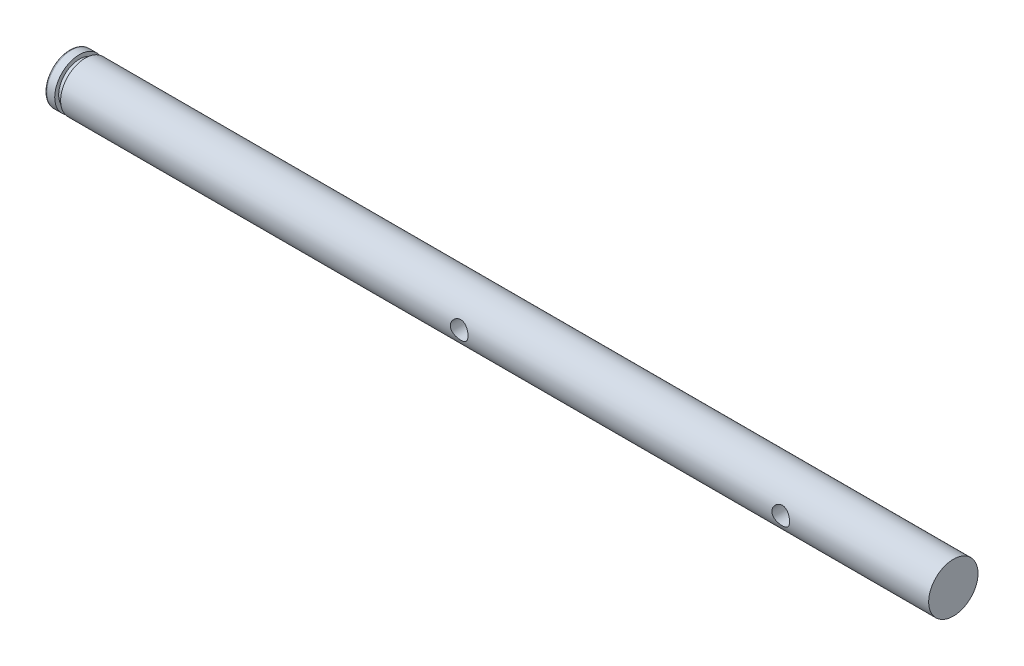
ISO-10303-21;
HEADER;
FILE_DESCRIPTION(('STEP AP214'),'2;1');
FILE_NAME('part.step','',(''),(''),'','','');
FILE_SCHEMA(('AUTOMOTIVE_DESIGN { 1 0 10303 214 1 1 1 1 }'));
ENDSEC;
DATA;
#1=APPLICATION_CONTEXT('core data for automotive mechanical design processes');
#2=APPLICATION_PROTOCOL_DEFINITION('international standard','automotive_design',2000,#1);
#3=PRODUCT_CONTEXT('',#1,'mechanical');
#4=PRODUCT('Part','Part','',(#3));
#5=PRODUCT_RELATED_PRODUCT_CATEGORY('part','',(#4));
#6=PRODUCT_DEFINITION_FORMATION('','',#4);
#7=PRODUCT_DEFINITION_CONTEXT('part definition',#1,'design');
#8=PRODUCT_DEFINITION('design','',#6,#7);
#9=PRODUCT_DEFINITION_SHAPE('','',#8);
#10=(LENGTH_UNIT() NAMED_UNIT(*) SI_UNIT(.MILLI.,.METRE.));
#11=(NAMED_UNIT(*) PLANE_ANGLE_UNIT() SI_UNIT($,.RADIAN.));
#12=(NAMED_UNIT(*) SI_UNIT($,.STERADIAN.) SOLID_ANGLE_UNIT());
#13=UNCERTAINTY_MEASURE_WITH_UNIT(LENGTH_MEASURE(1.E-05),#10,'distance_accuracy_value','');
#14=(GEOMETRIC_REPRESENTATION_CONTEXT(3) GLOBAL_UNCERTAINTY_ASSIGNED_CONTEXT((#13)) GLOBAL_UNIT_ASSIGNED_CONTEXT((#10,
#11,#12)) REPRESENTATION_CONTEXT('',''));
#15=CARTESIAN_POINT('',(0.,0.,0.));
#16=DIRECTION('',(0.,0.,1.));
#17=DIRECTION('',(1.,0.,0.));
#18=AXIS2_PLACEMENT_3D('',#15,#16,#17);
#19=CARTESIAN_POINT('',(-111.76,0.,0.));
#20=DIRECTION('',(1.,0.,0.));
#21=DIRECTION('',(0.,0.,-1.));
#22=AXIS2_PLACEMENT_3D('',#19,#20,#21);
#23=CYLINDRICAL_SURFACE('',#22,3.175);
#24=CARTESIAN_POINT('',(-59.309,0.,-3.175));
#25=CARTESIAN_POINT('',(-59.308998572082,-0.0620737268315115,-3.17500103437967));
#26=CARTESIAN_POINT('',(-59.3140726971616,-0.124137336558028,-3.17316341193257));
#27=CARTESIAN_POINT('',(-59.334160538585,-0.24641941397285,-3.16601537517199));
#28=CARTESIAN_POINT('',(-59.3491737062611,-0.306637983321425,-3.16070515255756));
#29=CARTESIAN_POINT('',(-59.3885464044118,-0.423449303479856,-3.14718455394148));
#30=CARTESIAN_POINT('',(-59.4128887853428,-0.48004848621335,-3.13897950158221));
#31=CARTESIAN_POINT('',(-59.4701452894881,-0.588358145376884,-3.12049390054908));
#32=CARTESIAN_POINT('',(-59.5030615073306,-0.640067422966728,-3.11021284483609));
#33=CARTESIAN_POINT('',(-59.5778958141428,-0.739177350093951,-3.08818914094429));
#34=CARTESIAN_POINT('',(-59.6200933400369,-0.786358252772523,-3.07640741466393));
#35=CARTESIAN_POINT('',(-59.7116990230828,-0.873147440903714,-3.05291072481347));
#36=CARTESIAN_POINT('',(-59.7611091368786,-0.91275366472671,-3.04119578025895));
#37=CARTESIAN_POINT('',(-59.8678212350839,-0.984612425223532,-3.01871377345015));
#38=CARTESIAN_POINT('',(-59.9253368047733,-1.0165638344466,-3.00799340628935));
#39=CARTESIAN_POINT('',(-60.0453727296764,-1.07024351405796,-2.98931724859945));
#40=CARTESIAN_POINT('',(-60.1078912540086,-1.09197550450546,-2.9813604523551));
#41=CARTESIAN_POINT('',(-60.2336386178566,-1.1237478192193,-2.96952774659106));
#42=CARTESIAN_POINT('',(-60.2967480797909,-1.1342049022227,-2.96550691784306));
#43=CARTESIAN_POINT('',(-60.4239441721476,-1.14443378610714,-2.96157547789097));
#44=CARTESIAN_POINT('',(-60.4880304296851,-1.14420956718883,-2.96166333565637));
#45=CARTESIAN_POINT('',(-60.6116482407503,-1.13340268234683,-2.96581362112711));
#46=CARTESIAN_POINT('',(-60.67123776419,-1.12338482974464,-2.96965932270567));
#47=CARTESIAN_POINT('',(-60.7878252784985,-1.09420418064689,-2.98053386657633));
#48=CARTESIAN_POINT('',(-60.8448229085689,-1.07504011521656,-2.98756315054798));
#49=CARTESIAN_POINT('',(-60.9558084733199,-1.02777926933496,-3.00415202126882));
#50=CARTESIAN_POINT('',(-61.0097240505982,-0.999528372581974,-3.01375474794739));
#51=CARTESIAN_POINT('',(-61.1122186410846,-0.935002992219219,-3.0343927698625));
#52=CARTESIAN_POINT('',(-61.1607959099343,-0.898725897548934,-3.04542853080607));
#53=CARTESIAN_POINT('',(-61.2543797474836,-0.816546040651984,-3.06851849406361));
#54=CARTESIAN_POINT('',(-61.2989825029522,-0.770188247370953,-3.08059357331203));
#55=CARTESIAN_POINT('',(-61.3798954600684,-0.670507493045859,-3.10381389893309));
#56=CARTESIAN_POINT('',(-61.4162045793302,-0.61718362429915,-3.11495902381893));
#57=CARTESIAN_POINT('',(-61.4798988481986,-0.504119459064531,-3.13525535974731));
#58=CARTESIAN_POINT('',(-61.507159363163,-0.444303497711961,-3.14437819070746));
#59=CARTESIAN_POINT('',(-61.5510998261946,-0.320525469133619,-3.15939343102799));
#60=CARTESIAN_POINT('',(-61.5677840901089,-0.25656510487232,-3.16528715795437));
#61=CARTESIAN_POINT('',(-61.5893449474873,-0.129719951007225,-3.17295346062183));
#62=CARTESIAN_POINT('',(-61.5947659846739,-0.0669390770178003,-3.17491588646435));
#63=CARTESIAN_POINT('',(-61.5952190167188,0.0586581264726204,-3.17507871407895));
#64=CARTESIAN_POINT('',(-61.5902531038972,0.121474446285268,-3.17327987351074));
#65=CARTESIAN_POINT('',(-61.5704938340541,0.243071634596295,-3.16624774676119));
#66=CARTESIAN_POINT('',(-61.5560487258316,0.301916855755422,-3.16113624167073));
#67=CARTESIAN_POINT('',(-61.5181909830933,0.416314030665209,-3.14811445828708));
#68=CARTESIAN_POINT('',(-61.4947771831711,0.471865555343804,-3.14020381627964));
#69=CARTESIAN_POINT('',(-61.4389185793754,0.579863523656534,-3.12209356027271));
#70=CARTESIAN_POINT('',(-61.4062360848428,0.632176900290035,-3.11183529723495));
#71=CARTESIAN_POINT('',(-61.3330401036264,0.730745443000551,-3.09017588376067));
#72=CARTESIAN_POINT('',(-61.2925238964668,0.776998495071577,-3.07877433695098));
#73=CARTESIAN_POINT('',(-61.2022616129236,0.864710384903051,-3.05533502979206));
#74=CARTESIAN_POINT('',(-61.1521383901614,0.905781703721741,-3.04329578482266));
#75=CARTESIAN_POINT('',(-61.0454644830971,0.978996162831984,-3.02054065709127));
#76=CARTESIAN_POINT('',(-60.9889134472563,1.01113881448115,-3.00982484677519));
#77=CARTESIAN_POINT('',(-60.8707081217548,1.06553723627284,-2.99100147938097));
#78=CARTESIAN_POINT('',(-60.8090462394078,1.08777797212475,-2.98289789361194));
#79=CARTESIAN_POINT('',(-60.6824840440375,1.12143097492093,-2.97041175910719));
#80=CARTESIAN_POINT('',(-60.6175855449045,1.13284923686847,-2.96602715042226));
#81=CARTESIAN_POINT('',(-60.4905536936788,1.14402104147899,-2.96173482510262));
#82=CARTESIAN_POINT('',(-60.4284858124712,1.14442871045564,-2.96157606449312));
#83=CARTESIAN_POINT('',(-60.3052164338672,1.13521921745472,-2.96511823543978));
#84=CARTESIAN_POINT('',(-60.2440148672917,1.1256028605692,-2.9688188570249));
#85=CARTESIAN_POINT('',(-60.1258138301173,1.09711156524155,-2.97946165008855));
#86=CARTESIAN_POINT('',(-60.0687465823189,1.0784828515192,-2.98631739120662));
#87=CARTESIAN_POINT('',(-59.958509480767,1.03270545607389,-3.00245409636044));
#88=CARTESIAN_POINT('',(-59.9053405767001,1.00555470672472,-3.01173564885784));
#89=CARTESIAN_POINT('',(-59.8015611834795,0.941946357892411,-3.0322482910311));
#90=CARTESIAN_POINT('',(-59.7512062847981,0.905095721407966,-3.04355296519931));
#91=CARTESIAN_POINT('',(-59.6571850221856,0.823762467874624,-3.06656563922532));
#92=CARTESIAN_POINT('',(-59.6135207048945,0.779277524288371,-3.07827376116103));
#93=CARTESIAN_POINT('',(-59.5319796896911,0.681367518487647,-3.10145286870255));
#94=CARTESIAN_POINT('',(-59.4944840560541,0.627614585698956,-3.11288513359185));
#95=CARTESIAN_POINT('',(-59.4290836934805,0.514175281788693,-3.13361916073851));
#96=CARTESIAN_POINT('',(-59.401178463652,0.454489220755151,-3.14292103425443));
#97=CARTESIAN_POINT('',(-59.355711400094,0.330185534863937,-3.15841103362814));
#98=CARTESIAN_POINT('',(-59.3382591931959,0.265523403132236,-3.16456606187923));
#99=CARTESIAN_POINT('',(-59.3149066098922,0.133902962299215,-3.17285917124974));
#100=CARTESIAN_POINT('',(-59.3090015399885,0.0669455973934905,-3.17499888443681));
#101=CARTESIAN_POINT('',(-59.309,0.,-3.175));
#102=B_SPLINE_CURVE_WITH_KNOTS('',3,(#24,#25,#26,#27,#28,#29,#30,#31,#32,#33,#34,#35,#36,#37,
#38,#39,#40,#41,#42,#43,#44,#45,#46,#47,#48,#49,#50,#51,#52,#53,#54,#55,#56,#57,#58,#59,#60,#61,
#62,#63,#64,#65,#66,#67,#68,#69,#70,#71,#72,#73,#74,#75,#76,#77,#78,#79,#80,#81,#82,#83,#84,#85,
#86,#87,#88,#89,#90,#91,#92,#93,#94,#95,#96,#97,#98,#99,#100,#101),.UNSPECIFIED.,.T.,.F.,(4,2,2,
2,2,2,2,2,2,2,2,2,2,2,2,2,2,2,2,2,2,2,2,2,2,2,2,2,2,2,2,2,2,2,2,2,2,2,4),(0.,0.185974454978021,
0.371938644415174,0.557562609943087,0.743231966873359,0.93553032042673,1.1278809383129,
1.3268730666022,1.52579270186127,1.71707692154643,1.90828986306503,2.08908884523657,
2.26991291854024,2.45398166054557,2.63811037156356,2.8335723279417,3.02905977911018,
3.22713778552899,3.42513491020089,3.61331470783594,3.80145660267398,3.9830467243357,
4.16466045012361,4.35143424101735,4.53827301121224,4.73508157176569,4.93190090101109,
5.12901805454704,5.32602595304393,5.51130234186587,5.69656385113178,5.87702752955926,
6.05753502618307,6.24694695884992,6.43641671719924,6.6350313916508,6.83363569119014,
7.03428796848484,7.23485867084055),.UNSPECIFIED.);
#103=CARTESIAN_POINT('',(-59.309,0.,-3.175));
#104=VERTEX_POINT('',#103);
#105=EDGE_CURVE('E10',#104,#104,#102,.T.);
#106=ORIENTED_EDGE('',*,*,#105,.F.);
#107=EDGE_LOOP('',(#106));
#108=FACE_BOUND('',#107,.T.);
#109=CARTESIAN_POINT('',(-59.309,0.,3.175));
#110=CARTESIAN_POINT('',(-59.308998572082,0.0620737268315115,3.17500103437967));
#111=CARTESIAN_POINT('',(-59.3140726971616,0.124137336558028,3.17316341193257));
#112=CARTESIAN_POINT('',(-59.334160538585,0.24641941397285,3.16601537517199));
#113=CARTESIAN_POINT('',(-59.3491737062611,0.306637983321425,3.16070515255756));
#114=CARTESIAN_POINT('',(-59.3885464044118,0.423449303479856,3.14718455394148));
#115=CARTESIAN_POINT('',(-59.4128887853428,0.48004848621335,3.13897950158221));
#116=CARTESIAN_POINT('',(-59.4701452894881,0.588358145376884,3.12049390054908));
#117=CARTESIAN_POINT('',(-59.5030615073306,0.640067422966728,3.11021284483609));
#118=CARTESIAN_POINT('',(-59.5778958141428,0.739177350093951,3.08818914094429));
#119=CARTESIAN_POINT('',(-59.6200933400369,0.786358252772523,3.07640741466393));
#120=CARTESIAN_POINT('',(-59.7116990230828,0.873147440903714,3.05291072481347));
#121=CARTESIAN_POINT('',(-59.7611091368786,0.91275366472671,3.04119578025895));
#122=CARTESIAN_POINT('',(-59.8678212350839,0.984612425223532,3.01871377345015));
#123=CARTESIAN_POINT('',(-59.9253368047733,1.0165638344466,3.00799340628935));
#124=CARTESIAN_POINT('',(-60.0453727296764,1.07024351405796,2.98931724859945));
#125=CARTESIAN_POINT('',(-60.1078912540086,1.09197550450546,2.9813604523551));
#126=CARTESIAN_POINT('',(-60.2336386178566,1.1237478192193,2.96952774659106));
#127=CARTESIAN_POINT('',(-60.2967480797909,1.1342049022227,2.96550691784306));
#128=CARTESIAN_POINT('',(-60.4239441721476,1.14443378610714,2.96157547789097));
#129=CARTESIAN_POINT('',(-60.4880304296851,1.14420956718883,2.96166333565637));
#130=CARTESIAN_POINT('',(-60.6116482407503,1.13340268234683,2.96581362112711));
#131=CARTESIAN_POINT('',(-60.67123776419,1.12338482974464,2.96965932270567));
#132=CARTESIAN_POINT('',(-60.7878252784985,1.09420418064689,2.98053386657633));
#133=CARTESIAN_POINT('',(-60.8448229085689,1.07504011521656,2.98756315054798));
#134=CARTESIAN_POINT('',(-60.9558084733199,1.02777926933496,3.00415202126882));
#135=CARTESIAN_POINT('',(-61.0097240505982,0.999528372581974,3.01375474794739));
#136=CARTESIAN_POINT('',(-61.1122186410846,0.935002992219219,3.0343927698625));
#137=CARTESIAN_POINT('',(-61.1607959099343,0.898725897548934,3.04542853080607));
#138=CARTESIAN_POINT('',(-61.2543797474836,0.816546040651984,3.06851849406361));
#139=CARTESIAN_POINT('',(-61.2989825029522,0.770188247370953,3.08059357331203));
#140=CARTESIAN_POINT('',(-61.3798954600684,0.670507493045859,3.10381389893309));
#141=CARTESIAN_POINT('',(-61.4162045793302,0.61718362429915,3.11495902381893));
#142=CARTESIAN_POINT('',(-61.4798988481986,0.504119459064531,3.13525535974731));
#143=CARTESIAN_POINT('',(-61.507159363163,0.444303497711961,3.14437819070746));
#144=CARTESIAN_POINT('',(-61.5510998261946,0.320525469133619,3.15939343102799));
#145=CARTESIAN_POINT('',(-61.5677840901089,0.25656510487232,3.16528715795437));
#146=CARTESIAN_POINT('',(-61.5893449474873,0.129719951007225,3.17295346062183));
#147=CARTESIAN_POINT('',(-61.5947659846739,0.0669390770178003,3.17491588646435));
#148=CARTESIAN_POINT('',(-61.5952190167188,-0.0586581264726204,3.17507871407895));
#149=CARTESIAN_POINT('',(-61.5902531038972,-0.121474446285268,3.17327987351074));
#150=CARTESIAN_POINT('',(-61.5704938340541,-0.243071634596295,3.16624774676119));
#151=CARTESIAN_POINT('',(-61.5560487258316,-0.301916855755422,3.16113624167073));
#152=CARTESIAN_POINT('',(-61.5181909830933,-0.416314030665209,3.14811445828708));
#153=CARTESIAN_POINT('',(-61.4947771831711,-0.471865555343804,3.14020381627964));
#154=CARTESIAN_POINT('',(-61.4389185793754,-0.579863523656534,3.12209356027271));
#155=CARTESIAN_POINT('',(-61.4062360848428,-0.632176900290035,3.11183529723495));
#156=CARTESIAN_POINT('',(-61.3330401036264,-0.730745443000551,3.09017588376067));
#157=CARTESIAN_POINT('',(-61.2925238964668,-0.776998495071577,3.07877433695098));
#158=CARTESIAN_POINT('',(-61.2022616129236,-0.864710384903051,3.05533502979206));
#159=CARTESIAN_POINT('',(-61.1521383901614,-0.905781703721741,3.04329578482266));
#160=CARTESIAN_POINT('',(-61.0454644830971,-0.978996162831984,3.02054065709127));
#161=CARTESIAN_POINT('',(-60.9889134472563,-1.01113881448115,3.00982484677519));
#162=CARTESIAN_POINT('',(-60.8707081217548,-1.06553723627284,2.99100147938097));
#163=CARTESIAN_POINT('',(-60.8090462394078,-1.08777797212475,2.98289789361194));
#164=CARTESIAN_POINT('',(-60.6824840440375,-1.12143097492093,2.97041175910719));
#165=CARTESIAN_POINT('',(-60.6175855449045,-1.13284923686847,2.96602715042226));
#166=CARTESIAN_POINT('',(-60.4905536936788,-1.14402104147899,2.96173482510262));
#167=CARTESIAN_POINT('',(-60.4284858124712,-1.14442871045564,2.96157606449312));
#168=CARTESIAN_POINT('',(-60.3052164338672,-1.13521921745472,2.96511823543978));
#169=CARTESIAN_POINT('',(-60.2440148672917,-1.1256028605692,2.9688188570249));
#170=CARTESIAN_POINT('',(-60.1258138301173,-1.09711156524155,2.97946165008855));
#171=CARTESIAN_POINT('',(-60.0687465823189,-1.0784828515192,2.98631739120662));
#172=CARTESIAN_POINT('',(-59.958509480767,-1.03270545607389,3.00245409636044));
#173=CARTESIAN_POINT('',(-59.9053405767001,-1.00555470672472,3.01173564885784));
#174=CARTESIAN_POINT('',(-59.8015611834795,-0.941946357892411,3.0322482910311));
#175=CARTESIAN_POINT('',(-59.7512062847981,-0.905095721407966,3.04355296519931));
#176=CARTESIAN_POINT('',(-59.6571850221856,-0.823762467874624,3.06656563922532));
#177=CARTESIAN_POINT('',(-59.6135207048945,-0.779277524288371,3.07827376116103));
#178=CARTESIAN_POINT('',(-59.5319796896911,-0.681367518487647,3.10145286870255));
#179=CARTESIAN_POINT('',(-59.4944840560541,-0.627614585698956,3.11288513359185));
#180=CARTESIAN_POINT('',(-59.4290836934805,-0.514175281788693,3.13361916073851));
#181=CARTESIAN_POINT('',(-59.401178463652,-0.454489220755151,3.14292103425443));
#182=CARTESIAN_POINT('',(-59.355711400094,-0.330185534863937,3.15841103362814));
#183=CARTESIAN_POINT('',(-59.3382591931959,-0.265523403132236,3.16456606187923));
#184=CARTESIAN_POINT('',(-59.3149066098922,-0.133902962299215,3.17285917124974));
#185=CARTESIAN_POINT('',(-59.3090015399885,-0.0669455973934905,3.17499888443681));
#186=CARTESIAN_POINT('',(-59.309,0.,3.175));
#187=B_SPLINE_CURVE_WITH_KNOTS('',3,(#109,#110,#111,#112,#113,#114,#115,#116,#117,#118,#119,
#120,#121,#122,#123,#124,#125,#126,#127,#128,#129,#130,#131,#132,#133,#134,#135,#136,#137,#138,
#139,#140,#141,#142,#143,#144,#145,#146,#147,#148,#149,#150,#151,#152,#153,#154,#155,#156,#157,
#158,#159,#160,#161,#162,#163,#164,#165,#166,#167,#168,#169,#170,#171,#172,#173,#174,#175,#176,
#177,#178,#179,#180,#181,#182,#183,#184,#185,#186),.UNSPECIFIED.,.T.,.F.,(4,2,2,2,2,2,2,2,2,2,2,
2,2,2,2,2,2,2,2,2,2,2,2,2,2,2,2,2,2,2,2,2,2,2,2,2,2,2,4),(0.,0.185974454978021,
0.371938644415174,0.557562609943087,0.743231966873359,0.93553032042673,1.1278809383129,
1.3268730666022,1.52579270186127,1.71707692154643,1.90828986306503,2.08908884523657,
2.26991291854024,2.45398166054557,2.63811037156356,2.8335723279417,3.02905977911018,
3.22713778552899,3.42513491020089,3.61331470783594,3.80145660267398,3.9830467243357,
4.16466045012361,4.35143424101735,4.53827301121224,4.73508157176569,4.93190090101109,
5.12901805454704,5.32602595304393,5.51130234186587,5.69656385113178,5.87702752955926,
6.05753502618307,6.24694695884992,6.43641671719924,6.6350313916508,6.83363569119014,
7.03428796848484,7.23485867084055),.UNSPECIFIED.);
#188=CARTESIAN_POINT('',(-59.309,0.,3.175));
#189=VERTEX_POINT('',#188);
#190=EDGE_CURVE('E43',#189,#189,#187,.T.);
#191=ORIENTED_EDGE('',*,*,#190,.F.);
#192=EDGE_LOOP('',(#191));
#193=FACE_BOUND('',#192,.T.);
#194=CARTESIAN_POINT('',(-17.907,0.,-3.175));
#195=CARTESIAN_POINT('',(-17.906998572082,-0.0620737268315117,-3.17500103437967));
#196=CARTESIAN_POINT('',(-17.9120726971616,-0.124137336558028,-3.17316341193257));
#197=CARTESIAN_POINT('',(-17.932160538585,-0.24641941397285,-3.16601537517199));
#198=CARTESIAN_POINT('',(-17.9471737062611,-0.306637983321425,-3.16070515255756));
#199=CARTESIAN_POINT('',(-17.9865464044118,-0.423449303479856,-3.14718455394148));
#200=CARTESIAN_POINT('',(-18.0108887853428,-0.480048486213349,-3.1389795015822));
#201=CARTESIAN_POINT('',(-18.0681452894881,-0.588358145376884,-3.12049390054908));
#202=CARTESIAN_POINT('',(-18.1010615073307,-0.640067422966729,-3.11021284483609));
#203=CARTESIAN_POINT('',(-18.1758958141428,-0.739177350093952,-3.08818914094429));
#204=CARTESIAN_POINT('',(-18.2180933400369,-0.786358252772524,-3.07640741466393));
#205=CARTESIAN_POINT('',(-18.3096990230828,-0.873147440903717,-3.05291072481347));
#206=CARTESIAN_POINT('',(-18.3591091368786,-0.912753664726713,-3.04119578025895));
#207=CARTESIAN_POINT('',(-18.4658212350839,-0.984612425223532,-3.01871377345015));
#208=CARTESIAN_POINT('',(-18.5233368047732,-1.0165638344466,-3.00799340628935));
#209=CARTESIAN_POINT('',(-18.6433727296764,-1.07024351405796,-2.98931724859945));
#210=CARTESIAN_POINT('',(-18.7058912540086,-1.09197550450547,-2.9813604523551));
#211=CARTESIAN_POINT('',(-18.8316386178566,-1.12374781921931,-2.96952774659106));
#212=CARTESIAN_POINT('',(-18.8947480797909,-1.1342049022227,-2.96550691784306));
#213=CARTESIAN_POINT('',(-19.0219441721476,-1.14443378610714,-2.96157547789097));
#214=CARTESIAN_POINT('',(-19.0860304296851,-1.14420956718884,-2.96166333565637));
#215=CARTESIAN_POINT('',(-19.2096482407503,-1.13340268234683,-2.96581362112711));
#216=CARTESIAN_POINT('',(-19.26923776419,-1.12338482974465,-2.96965932270566));
#217=CARTESIAN_POINT('',(-19.3858252784985,-1.09420418064689,-2.98053386657632));
#218=CARTESIAN_POINT('',(-19.4428229085689,-1.07504011521656,-2.98756315054798));
#219=CARTESIAN_POINT('',(-19.5538084733199,-1.02777926933496,-3.00415202126882));
#220=CARTESIAN_POINT('',(-19.6077240505982,-0.999528372581978,-3.01375474794738));
#221=CARTESIAN_POINT('',(-19.7102186410846,-0.935002992219224,-3.0343927698625));
#222=CARTESIAN_POINT('',(-19.7587959099343,-0.898725897548939,-3.04542853080607));
#223=CARTESIAN_POINT('',(-19.8523797474836,-0.81654604065199,-3.0685184940636));
#224=CARTESIAN_POINT('',(-19.8969825029522,-0.770188247370959,-3.08059357331203));
#225=CARTESIAN_POINT('',(-19.9778954600684,-0.670507493045863,-3.10381389893309));
#226=CARTESIAN_POINT('',(-20.0142045793303,-0.617183624299153,-3.11495902381893));
#227=CARTESIAN_POINT('',(-20.0778988481986,-0.504119459064532,-3.13525535974731));
#228=CARTESIAN_POINT('',(-20.105159363163,-0.444303497711962,-3.14437819070746));
#229=CARTESIAN_POINT('',(-20.1490998261946,-0.320525469133619,-3.15939343102799));
#230=CARTESIAN_POINT('',(-20.1657840901089,-0.256565104872318,-3.16528715795437));
#231=CARTESIAN_POINT('',(-20.1873449474873,-0.129719951007223,-3.17295346062183));
#232=CARTESIAN_POINT('',(-20.1927659846739,-0.0669390770177993,-3.17491588646435));
#233=CARTESIAN_POINT('',(-20.1932190167188,0.05865812647262,-3.17507871407895));
#234=CARTESIAN_POINT('',(-20.1882531038972,0.121474446285267,-3.17327987351074));
#235=CARTESIAN_POINT('',(-20.1684938340541,0.243071634596295,-3.16624774676119));
#236=CARTESIAN_POINT('',(-20.1540487258316,0.301916855755423,-3.16113624167073));
#237=CARTESIAN_POINT('',(-20.1161909830933,0.41631403066521,-3.14811445828708));
#238=CARTESIAN_POINT('',(-20.0927771831711,0.471865555343804,-3.14020381627964));
#239=CARTESIAN_POINT('',(-20.0369185793754,0.579863523656535,-3.12209356027271));
#240=CARTESIAN_POINT('',(-20.0042360848428,0.632176900290037,-3.11183529723495));
#241=CARTESIAN_POINT('',(-19.9310401036264,0.730745443000553,-3.09017588376067));
#242=CARTESIAN_POINT('',(-19.8905238964668,0.776998495071577,-3.07877433695098));
#243=CARTESIAN_POINT('',(-19.8002616129237,0.864710384903051,-3.05533502979206));
#244=CARTESIAN_POINT('',(-19.7501383901615,0.905781703721742,-3.04329578482266));
#245=CARTESIAN_POINT('',(-19.6434644830971,0.978996162831987,-3.02054065709127));
#246=CARTESIAN_POINT('',(-19.5869134472563,1.01113881448115,-3.00982484677519));
#247=CARTESIAN_POINT('',(-19.4687081217549,1.06553723627284,-2.99100147938097));
#248=CARTESIAN_POINT('',(-19.4070462394078,1.08777797212475,-2.98289789361194));
#249=CARTESIAN_POINT('',(-19.2804840440375,1.12143097492094,-2.97041175910719));
#250=CARTESIAN_POINT('',(-19.2155855449045,1.13284923686847,-2.96602715042226));
#251=CARTESIAN_POINT('',(-19.0885536936788,1.14402104147899,-2.96173482510261));
#252=CARTESIAN_POINT('',(-19.0264858124712,1.14442871045564,-2.96157606449312));
#253=CARTESIAN_POINT('',(-18.9032164338672,1.13521921745473,-2.96511823543978));
#254=CARTESIAN_POINT('',(-18.8420148672918,1.1256028605692,-2.9688188570249));
#255=CARTESIAN_POINT('',(-18.7238138301173,1.09711156524156,-2.97946165008855));
#256=CARTESIAN_POINT('',(-18.666746582319,1.07848285151921,-2.98631739120662));
#257=CARTESIAN_POINT('',(-18.556509480767,1.0327054560739,-3.00245409636044));
#258=CARTESIAN_POINT('',(-18.5033405767001,1.00555470672473,-3.01173564885784));
#259=CARTESIAN_POINT('',(-18.3995611834795,0.941946357892414,-3.03224829103109));
#260=CARTESIAN_POINT('',(-18.3492062847981,0.905095721407969,-3.04355296519931));
#261=CARTESIAN_POINT('',(-18.2551850221856,0.823762467874627,-3.06656563922532));
#262=CARTESIAN_POINT('',(-18.2115207048945,0.779277524288374,-3.07827376116103));
#263=CARTESIAN_POINT('',(-18.1299796896911,0.68136751848765,-3.10145286870255));
#264=CARTESIAN_POINT('',(-18.0924840560541,0.627614585698958,-3.11288513359185));
#265=CARTESIAN_POINT('',(-18.0270836934805,0.514175281788695,-3.13361916073851));
#266=CARTESIAN_POINT('',(-17.999178463652,0.454489220755153,-3.14292103425443));
#267=CARTESIAN_POINT('',(-17.953711400094,0.330185534863939,-3.15841103362814));
#268=CARTESIAN_POINT('',(-17.9362591931959,0.265523403132238,-3.16456606187923));
#269=CARTESIAN_POINT('',(-17.9129066098922,0.133902962299216,-3.17285917124974));
#270=CARTESIAN_POINT('',(-17.9070015399885,0.066945597393491,-3.17499888443681));
#271=CARTESIAN_POINT('',(-17.907,0.,-3.175));
#272=B_SPLINE_CURVE_WITH_KNOTS('',3,(#194,#195,#196,#197,#198,#199,#200,#201,#202,#203,#204,
#205,#206,#207,#208,#209,#210,#211,#212,#213,#214,#215,#216,#217,#218,#219,#220,#221,#222,#223,
#224,#225,#226,#227,#228,#229,#230,#231,#232,#233,#234,#235,#236,#237,#238,#239,#240,#241,#242,
#243,#244,#245,#246,#247,#248,#249,#250,#251,#252,#253,#254,#255,#256,#257,#258,#259,#260,#261,
#262,#263,#264,#265,#266,#267,#268,#269,#270,#271),.UNSPECIFIED.,.T.,.F.,(4,2,2,2,2,2,2,2,2,2,2,
2,2,2,2,2,2,2,2,2,2,2,2,2,2,2,2,2,2,2,2,2,2,2,2,2,2,2,4),(0.,0.185974454978021,
0.371938644415175,0.557562609943086,0.743231966873361,0.935530320426729,1.1278809383129,
1.32687306660219,1.52579270186128,1.71707692154644,1.90828986306503,2.08908884523657,
2.26991291854025,2.45398166054558,2.63811037156356,2.83357232794171,3.02905977911019,
3.22713778552901,3.42513491020091,3.61331470783596,3.80145660267399,3.98304672433572,
4.16466045012363,4.35143424101736,4.53827301121225,4.7350815717657,4.93190090101111,
5.12901805454706,5.32602595304394,5.51130234186589,5.6965638511318,5.87702752955927,
6.05753502618309,6.24694695884994,6.43641671719926,6.63503139165082,6.83363569119016,
7.03428796848487,7.23485867084057),.UNSPECIFIED.);
#273=CARTESIAN_POINT('',(-17.907,0.,-3.175));
#274=VERTEX_POINT('',#273);
#275=EDGE_CURVE('E47',#274,#274,#272,.T.);
#276=ORIENTED_EDGE('',*,*,#275,.F.);
#277=EDGE_LOOP('',(#276));
#278=FACE_BOUND('',#277,.T.);
#279=CARTESIAN_POINT('',(-17.907,0.,3.175));
#280=CARTESIAN_POINT('',(-17.906998572082,0.0620737268315117,3.17500103437967));
#281=CARTESIAN_POINT('',(-17.9120726971616,0.124137336558028,3.17316341193257));
#282=CARTESIAN_POINT('',(-17.932160538585,0.24641941397285,3.16601537517199));
#283=CARTESIAN_POINT('',(-17.9471737062611,0.306637983321425,3.16070515255756));
#284=CARTESIAN_POINT('',(-17.9865464044118,0.423449303479856,3.14718455394148));
#285=CARTESIAN_POINT('',(-18.0108887853428,0.480048486213349,3.1389795015822));
#286=CARTESIAN_POINT('',(-18.0681452894881,0.588358145376884,3.12049390054908));
#287=CARTESIAN_POINT('',(-18.1010615073307,0.640067422966729,3.11021284483609));
#288=CARTESIAN_POINT('',(-18.1758958141428,0.739177350093952,3.08818914094429));
#289=CARTESIAN_POINT('',(-18.2180933400369,0.786358252772524,3.07640741466393));
#290=CARTESIAN_POINT('',(-18.3096990230828,0.873147440903717,3.05291072481347));
#291=CARTESIAN_POINT('',(-18.3591091368786,0.912753664726713,3.04119578025895));
#292=CARTESIAN_POINT('',(-18.4658212350839,0.984612425223532,3.01871377345015));
#293=CARTESIAN_POINT('',(-18.5233368047732,1.0165638344466,3.00799340628935));
#294=CARTESIAN_POINT('',(-18.6433727296764,1.07024351405796,2.98931724859945));
#295=CARTESIAN_POINT('',(-18.7058912540086,1.09197550450547,2.9813604523551));
#296=CARTESIAN_POINT('',(-18.8316386178566,1.12374781921931,2.96952774659106));
#297=CARTESIAN_POINT('',(-18.8947480797909,1.1342049022227,2.96550691784306));
#298=CARTESIAN_POINT('',(-19.0219441721476,1.14443378610714,2.96157547789097));
#299=CARTESIAN_POINT('',(-19.0860304296851,1.14420956718884,2.96166333565637));
#300=CARTESIAN_POINT('',(-19.2096482407503,1.13340268234683,2.96581362112711));
#301=CARTESIAN_POINT('',(-19.26923776419,1.12338482974465,2.96965932270566));
#302=CARTESIAN_POINT('',(-19.3858252784985,1.09420418064689,2.98053386657632));
#303=CARTESIAN_POINT('',(-19.4428229085689,1.07504011521656,2.98756315054798));
#304=CARTESIAN_POINT('',(-19.5538084733199,1.02777926933496,3.00415202126882));
#305=CARTESIAN_POINT('',(-19.6077240505982,0.999528372581978,3.01375474794738));
#306=CARTESIAN_POINT('',(-19.7102186410846,0.935002992219224,3.0343927698625));
#307=CARTESIAN_POINT('',(-19.7587959099343,0.898725897548939,3.04542853080607));
#308=CARTESIAN_POINT('',(-19.8523797474836,0.81654604065199,3.0685184940636));
#309=CARTESIAN_POINT('',(-19.8969825029522,0.770188247370959,3.08059357331203));
#310=CARTESIAN_POINT('',(-19.9778954600684,0.670507493045863,3.10381389893309));
#311=CARTESIAN_POINT('',(-20.0142045793303,0.617183624299153,3.11495902381893));
#312=CARTESIAN_POINT('',(-20.0778988481986,0.504119459064532,3.13525535974731));
#313=CARTESIAN_POINT('',(-20.105159363163,0.444303497711962,3.14437819070746));
#314=CARTESIAN_POINT('',(-20.1490998261946,0.320525469133619,3.15939343102799));
#315=CARTESIAN_POINT('',(-20.1657840901089,0.256565104872318,3.16528715795437));
#316=CARTESIAN_POINT('',(-20.1873449474873,0.129719951007223,3.17295346062183));
#317=CARTESIAN_POINT('',(-20.1927659846739,0.0669390770177993,3.17491588646435));
#318=CARTESIAN_POINT('',(-20.1932190167188,-0.05865812647262,3.17507871407895));
#319=CARTESIAN_POINT('',(-20.1882531038972,-0.121474446285267,3.17327987351074));
#320=CARTESIAN_POINT('',(-20.1684938340541,-0.243071634596295,3.16624774676119));
#321=CARTESIAN_POINT('',(-20.1540487258316,-0.301916855755423,3.16113624167073));
#322=CARTESIAN_POINT('',(-20.1161909830933,-0.41631403066521,3.14811445828708));
#323=CARTESIAN_POINT('',(-20.0927771831711,-0.471865555343804,3.14020381627964));
#324=CARTESIAN_POINT('',(-20.0369185793754,-0.579863523656535,3.12209356027271));
#325=CARTESIAN_POINT('',(-20.0042360848428,-0.632176900290037,3.11183529723495));
#326=CARTESIAN_POINT('',(-19.9310401036264,-0.730745443000553,3.09017588376067));
#327=CARTESIAN_POINT('',(-19.8905238964668,-0.776998495071577,3.07877433695098));
#328=CARTESIAN_POINT('',(-19.8002616129237,-0.864710384903051,3.05533502979206));
#329=CARTESIAN_POINT('',(-19.7501383901615,-0.905781703721742,3.04329578482266));
#330=CARTESIAN_POINT('',(-19.6434644830971,-0.978996162831987,3.02054065709127));
#331=CARTESIAN_POINT('',(-19.5869134472563,-1.01113881448115,3.00982484677519));
#332=CARTESIAN_POINT('',(-19.4687081217549,-1.06553723627284,2.99100147938097));
#333=CARTESIAN_POINT('',(-19.4070462394078,-1.08777797212475,2.98289789361194));
#334=CARTESIAN_POINT('',(-19.2804840440375,-1.12143097492094,2.97041175910719));
#335=CARTESIAN_POINT('',(-19.2155855449045,-1.13284923686847,2.96602715042226));
#336=CARTESIAN_POINT('',(-19.0885536936788,-1.14402104147899,2.96173482510261));
#337=CARTESIAN_POINT('',(-19.0264858124712,-1.14442871045564,2.96157606449312));
#338=CARTESIAN_POINT('',(-18.9032164338672,-1.13521921745473,2.96511823543978));
#339=CARTESIAN_POINT('',(-18.8420148672918,-1.1256028605692,2.9688188570249));
#340=CARTESIAN_POINT('',(-18.7238138301173,-1.09711156524156,2.97946165008855));
#341=CARTESIAN_POINT('',(-18.666746582319,-1.07848285151921,2.98631739120662));
#342=CARTESIAN_POINT('',(-18.556509480767,-1.0327054560739,3.00245409636044));
#343=CARTESIAN_POINT('',(-18.5033405767001,-1.00555470672473,3.01173564885784));
#344=CARTESIAN_POINT('',(-18.3995611834795,-0.941946357892414,3.03224829103109));
#345=CARTESIAN_POINT('',(-18.3492062847981,-0.905095721407969,3.04355296519931));
#346=CARTESIAN_POINT('',(-18.2551850221856,-0.823762467874627,3.06656563922532));
#347=CARTESIAN_POINT('',(-18.2115207048945,-0.779277524288374,3.07827376116103));
#348=CARTESIAN_POINT('',(-18.1299796896911,-0.68136751848765,3.10145286870255));
#349=CARTESIAN_POINT('',(-18.0924840560541,-0.627614585698958,3.11288513359185));
#350=CARTESIAN_POINT('',(-18.0270836934805,-0.514175281788695,3.13361916073851));
#351=CARTESIAN_POINT('',(-17.999178463652,-0.454489220755153,3.14292103425443));
#352=CARTESIAN_POINT('',(-17.953711400094,-0.330185534863939,3.15841103362814));
#353=CARTESIAN_POINT('',(-17.9362591931959,-0.265523403132238,3.16456606187923));
#354=CARTESIAN_POINT('',(-17.9129066098922,-0.133902962299216,3.17285917124974));
#355=CARTESIAN_POINT('',(-17.9070015399885,-0.066945597393491,3.17499888443681));
#356=CARTESIAN_POINT('',(-17.907,0.,3.175));
#357=B_SPLINE_CURVE_WITH_KNOTS('',3,(#279,#280,#281,#282,#283,#284,#285,#286,#287,#288,#289,
#290,#291,#292,#293,#294,#295,#296,#297,#298,#299,#300,#301,#302,#303,#304,#305,#306,#307,#308,
#309,#310,#311,#312,#313,#314,#315,#316,#317,#318,#319,#320,#321,#322,#323,#324,#325,#326,#327,
#328,#329,#330,#331,#332,#333,#334,#335,#336,#337,#338,#339,#340,#341,#342,#343,#344,#345,#346,
#347,#348,#349,#350,#351,#352,#353,#354,#355,#356),.UNSPECIFIED.,.T.,.F.,(4,2,2,2,2,2,2,2,2,2,2,
2,2,2,2,2,2,2,2,2,2,2,2,2,2,2,2,2,2,2,2,2,2,2,2,2,2,2,4),(0.,0.185974454978021,
0.371938644415175,0.557562609943086,0.743231966873361,0.935530320426729,1.1278809383129,
1.32687306660219,1.52579270186128,1.71707692154644,1.90828986306503,2.08908884523657,
2.26991291854025,2.45398166054558,2.63811037156356,2.83357232794171,3.02905977911019,
3.22713778552901,3.42513491020091,3.61331470783596,3.80145660267399,3.98304672433572,
4.16466045012363,4.35143424101736,4.53827301121225,4.7350815717657,4.93190090101111,
5.12901805454706,5.32602595304394,5.51130234186589,5.6965638511318,5.87702752955927,
6.05753502618309,6.24694695884994,6.43641671719926,6.63503139165082,6.83363569119016,
7.03428796848487,7.23485867084057),.UNSPECIFIED.);
#358=CARTESIAN_POINT('',(-17.907,0.,3.175));
#359=VERTEX_POINT('',#358);
#360=EDGE_CURVE('E51',#359,#359,#357,.T.);
#361=ORIENTED_EDGE('',*,*,#360,.F.);
#362=EDGE_LOOP('',(#361));
#363=FACE_BOUND('',#362,.T.);
#364=CARTESIAN_POINT('',(-111.76,0.,0.));
#365=DIRECTION('',(1.,0.,0.));
#366=DIRECTION('',(0.,0.,-1.));
#367=AXIS2_PLACEMENT_3D('',#364,#365,#366);
#368=CIRCLE('',#367,3.175);
#369=CARTESIAN_POINT('',(-111.76,0.,-3.175));
#370=VERTEX_POINT('',#369);
#371=EDGE_CURVE('E87',#370,#370,#368,.T.);
#372=ORIENTED_EDGE('',*,*,#371,.T.);
#373=EDGE_LOOP('',(#372));
#374=FACE_BOUND('',#373,.T.);
#375=CARTESIAN_POINT('',(0.,0.,0.));
#376=DIRECTION('',(1.,0.,0.));
#377=DIRECTION('',(0.,0.,-1.));
#378=AXIS2_PLACEMENT_3D('',#375,#376,#377);
#379=CIRCLE('',#378,3.175);
#380=CARTESIAN_POINT('',(0.,0.,-3.175));
#381=VERTEX_POINT('',#380);
#382=EDGE_CURVE('E84',#381,#381,#379,.T.);
#383=ORIENTED_EDGE('',*,*,#382,.F.);
#384=EDGE_LOOP('',(#383));
#385=FACE_BOUND('',#384,.T.);
#386=ADVANCED_FACE('F33',(#108,#193,#278,#363,#374,#385),#23,.T.);
#387=CARTESIAN_POINT('',(-111.76,0.,0.));
#388=DIRECTION('',(1.,0.,0.));
#389=DIRECTION('',(0.,0.,-1.));
#390=AXIS2_PLACEMENT_3D('',#387,#388,#389);
#391=PLANE('',#390);
#392=CARTESIAN_POINT('',(-111.76,0.,0.));
#393=DIRECTION('',(-1.,0.,0.));
#394=DIRECTION('',(0.,0.,1.));
#395=AXIS2_PLACEMENT_3D('',#392,#393,#394);
#396=CIRCLE('',#395,2.667);
#397=CARTESIAN_POINT('',(-111.76,0.,-2.667));
#398=VERTEX_POINT('',#397);
#399=EDGE_CURVE('E83',#398,#398,#396,.T.);
#400=ORIENTED_EDGE('',*,*,#399,.F.);
#401=EDGE_LOOP('',(#400));
#402=FACE_BOUND('',#401,.T.);
#403=ORIENTED_EDGE('',*,*,#371,.F.);
#404=EDGE_LOOP('',(#403));
#405=FACE_BOUND('',#404,.T.);
#406=ADVANCED_FACE('F112',(#402,#405),#391,.F.);
#407=CARTESIAN_POINT('',(0.,0.,0.));
#408=DIRECTION('',(1.,0.,0.));
#409=DIRECTION('',(0.,0.,-1.));
#410=AXIS2_PLACEMENT_3D('',#407,#408,#409);
#411=PLANE('',#410);
#412=ORIENTED_EDGE('',*,*,#382,.T.);
#413=EDGE_LOOP('',(#412));
#414=FACE_BOUND('',#413,.T.);
#415=ADVANCED_FACE('F117',(#414),#411,.T.);
#416=CARTESIAN_POINT('',(-112.522,0.,0.));
#417=DIRECTION('',(1.,0.,0.));
#418=DIRECTION('',(0.,0.,-1.));
#419=AXIS2_PLACEMENT_3D('',#416,#417,#418);
#420=CYLINDRICAL_SURFACE('',#419,2.667);
#421=CARTESIAN_POINT('',(-112.522,0.,0.));
#422=DIRECTION('',(-1.,0.,0.));
#423=DIRECTION('',(0.,0.,1.));
#424=AXIS2_PLACEMENT_3D('',#421,#422,#423);
#425=CIRCLE('',#424,2.667);
#426=CARTESIAN_POINT('',(-112.522,0.,-2.667));
#427=VERTEX_POINT('',#426);
#428=EDGE_CURVE('E88',#427,#427,#425,.T.);
#429=CARTESIAN_POINT('',(-112.522,0.,-2.667));
#430=CARTESIAN_POINT('',(-112.5140625,0.,-2.667));
#431=CARTESIAN_POINT('',(-112.506125,0.,-2.667));
#432=CARTESIAN_POINT('',(-112.49025,0.,-2.667));
#433=CARTESIAN_POINT('',(-112.4823125,0.,-2.667));
#434=CARTESIAN_POINT('',(-112.4664375,0.,-2.667));
#435=CARTESIAN_POINT('',(-112.4585,0.,-2.667));
#436=CARTESIAN_POINT('',(-112.442625,0.,-2.667));
#437=CARTESIAN_POINT('',(-112.4346875,0.,-2.667));
#438=CARTESIAN_POINT('',(-112.4188125,0.,-2.667));
#439=CARTESIAN_POINT('',(-112.410875,0.,-2.667));
#440=CARTESIAN_POINT('',(-112.395,0.,-2.667));
#441=CARTESIAN_POINT('',(-112.3870625,0.,-2.667));
#442=CARTESIAN_POINT('',(-112.3711875,0.,-2.667));
#443=CARTESIAN_POINT('',(-112.36325,0.,-2.667));
#444=CARTESIAN_POINT('',(-112.347375,0.,-2.667));
#445=CARTESIAN_POINT('',(-112.3394375,0.,-2.667));
#446=CARTESIAN_POINT('',(-112.3235625,0.,-2.667));
#447=CARTESIAN_POINT('',(-112.315625,0.,-2.667));
#448=CARTESIAN_POINT('',(-112.29975,0.,-2.667));
#449=CARTESIAN_POINT('',(-112.2918125,0.,-2.667));
#450=CARTESIAN_POINT('',(-112.2759375,0.,-2.667));
#451=CARTESIAN_POINT('',(-112.268,0.,-2.667));
#452=CARTESIAN_POINT('',(-112.252125,0.,-2.667));
#453=CARTESIAN_POINT('',(-112.2441875,0.,-2.667));
#454=CARTESIAN_POINT('',(-112.2283125,0.,-2.667));
#455=CARTESIAN_POINT('',(-112.220375,0.,-2.667));
#456=CARTESIAN_POINT('',(-112.2045,0.,-2.667));
#457=CARTESIAN_POINT('',(-112.1965625,0.,-2.667));
#458=CARTESIAN_POINT('',(-112.1806875,0.,-2.667));
#459=CARTESIAN_POINT('',(-112.17275,0.,-2.667));
#460=CARTESIAN_POINT('',(-112.156875,0.,-2.667));
#461=CARTESIAN_POINT('',(-112.1489375,0.,-2.667));
#462=CARTESIAN_POINT('',(-112.1330625,0.,-2.667));
#463=CARTESIAN_POINT('',(-112.125125,0.,-2.667));
#464=CARTESIAN_POINT('',(-112.10925,0.,-2.667));
#465=CARTESIAN_POINT('',(-112.1013125,0.,-2.667));
#466=CARTESIAN_POINT('',(-112.0854375,0.,-2.667));
#467=CARTESIAN_POINT('',(-112.0775,0.,-2.667));
#468=CARTESIAN_POINT('',(-112.061625,0.,-2.667));
#469=CARTESIAN_POINT('',(-112.0536875,0.,-2.667));
#470=CARTESIAN_POINT('',(-112.0378125,0.,-2.667));
#471=CARTESIAN_POINT('',(-112.029875,0.,-2.667));
#472=CARTESIAN_POINT('',(-112.014,0.,-2.667));
#473=CARTESIAN_POINT('',(-112.0060625,0.,-2.667));
#474=CARTESIAN_POINT('',(-111.9901875,0.,-2.667));
#475=CARTESIAN_POINT('',(-111.98225,0.,-2.667));
#476=CARTESIAN_POINT('',(-111.966375,0.,-2.667));
#477=CARTESIAN_POINT('',(-111.9584375,0.,-2.667));
#478=CARTESIAN_POINT('',(-111.9425625,0.,-2.667));
#479=CARTESIAN_POINT('',(-111.934625,0.,-2.667));
#480=CARTESIAN_POINT('',(-111.91875,0.,-2.667));
#481=CARTESIAN_POINT('',(-111.9108125,0.,-2.667));
#482=CARTESIAN_POINT('',(-111.8949375,0.,-2.667));
#483=CARTESIAN_POINT('',(-111.887,0.,-2.667));
#484=CARTESIAN_POINT('',(-111.871125,0.,-2.667));
#485=CARTESIAN_POINT('',(-111.8631875,0.,-2.667));
#486=CARTESIAN_POINT('',(-111.8473125,0.,-2.667));
#487=CARTESIAN_POINT('',(-111.839375,0.,-2.667));
#488=CARTESIAN_POINT('',(-111.8235,0.,-2.667));
#489=CARTESIAN_POINT('',(-111.8155625,0.,-2.667));
#490=CARTESIAN_POINT('',(-111.7996875,0.,-2.667));
#491=CARTESIAN_POINT('',(-111.79175,0.,-2.667));
#492=CARTESIAN_POINT('',(-111.775875,0.,-2.667));
#493=CARTESIAN_POINT('',(-111.7679375,0.,-2.667));
#494=CARTESIAN_POINT('',(-111.76,0.,-2.667));
#495=B_SPLINE_CURVE_WITH_KNOTS('',3,(#429,#430,#431,#432,#433,#434,#435,#436,#437,#438,#439,
#440,#441,#442,#443,#444,#445,#446,#447,#448,#449,#450,#451,#452,#453,#454,#455,#456,#457,#458,
#459,#460,#461,#462,#463,#464,#465,#466,#467,#468,#469,#470,#471,#472,#473,#474,#475,#476,#477,
#478,#479,#480,#481,#482,#483,#484,#485,#486,#487,#488,#489,#490,#491,#492,#493,#494),
.UNSPECIFIED.,.F.,.F.,(4,2,2,2,2,2,2,2,2,2,2,2,2,2,2,2,2,2,2,2,2,2,2,2,2,2,2,2,2,2,2,2,4),(0.,
0.0238124999999978,0.0476249999999956,0.0714374999999934,0.0952499999999912,0.119062499999989,
0.142874999999987,0.166687499999998,0.190499999999996,0.214312499999994,0.238124999999992,
0.26193749999999,0.285749999999987,0.309562499999999,0.333374999999997,0.357187499999995,
0.380999999999992,0.40481249999999,0.428624999999988,0.452437499999986,0.476249999999998,
0.500062499999995,0.523874999999993,0.547687499999991,0.571499999999989,0.595312499999986,
0.619124999999998,0.642937499999996,0.666749999999994,0.690562499999992,0.714374999999989,
0.738187499999987,0.761999999999985),.UNSPECIFIED.);
#496=EDGE_CURVE('BSEAM131',#427,#398,#495,.T.);
#497=ORIENTED_EDGE('',*,*,#428,.F.);
#498=ORIENTED_EDGE('',*,*,#399,.T.);
#499=ORIENTED_EDGE('',*,*,#496,.T.);
#500=ORIENTED_EDGE('',*,*,#496,.F.);
#501=EDGE_LOOP('',(#497,#499,#498,#500));
#502=FACE_BOUND('',#501,.T.);
#503=ADVANCED_FACE('F131',(#502),#420,.T.);
#504=CARTESIAN_POINT('',(-113.792,0.,0.));
#505=DIRECTION('',(1.,0.,0.));
#506=DIRECTION('',(0.,0.,-1.));
#507=AXIS2_PLACEMENT_3D('',#504,#505,#506);
#508=CYLINDRICAL_SURFACE('',#507,3.175);
#509=CARTESIAN_POINT('',(-113.538,0.,0.));
#510=DIRECTION('',(-1.,0.,0.));
#511=DIRECTION('',(0.,0.,1.));
#512=AXIS2_PLACEMENT_3D('',#509,#510,#511);
#513=CIRCLE('',#512,3.175);
#514=CARTESIAN_POINT('',(-113.538,0.,3.175));
#515=VERTEX_POINT('',#514);
#516=EDGE_CURVE('E77',#515,#515,#513,.F.);
#517=ORIENTED_EDGE('',*,*,#516,.T.);
#518=EDGE_LOOP('',(#517));
#519=FACE_BOUND('',#518,.T.);
#520=CARTESIAN_POINT('',(-112.522,0.,0.));
#521=DIRECTION('',(-1.,0.,0.));
#522=DIRECTION('',(0.,0.,1.));
#523=AXIS2_PLACEMENT_3D('',#520,#521,#522);
#524=CIRCLE('',#523,3.175);
#525=CARTESIAN_POINT('',(-112.522,0.,3.175));
#526=VERTEX_POINT('',#525);
#527=EDGE_CURVE('E95',#526,#526,#524,.T.);
#528=ORIENTED_EDGE('',*,*,#527,.T.);
#529=EDGE_LOOP('',(#528));
#530=FACE_BOUND('',#529,.T.);
#531=ADVANCED_FACE('F99',(#519,#530),#508,.T.);
#532=CARTESIAN_POINT('',(-113.792,0.,0.));
#533=DIRECTION('',(-1.,0.,0.));
#534=DIRECTION('',(0.,0.,1.));
#535=AXIS2_PLACEMENT_3D('',#532,#533,#534);
#536=PLANE('',#535);
#537=CARTESIAN_POINT('',(-113.792,0.,0.));
#538=DIRECTION('',(-1.,0.,0.));
#539=DIRECTION('',(0.,0.,1.));
#540=AXIS2_PLACEMENT_3D('',#537,#538,#539);
#541=CIRCLE('',#540,2.921);
#542=CARTESIAN_POINT('',(-113.792,0.,2.921));
#543=VERTEX_POINT('',#542);
#544=EDGE_CURVE('E80',#543,#543,#541,.T.);
#545=ORIENTED_EDGE('',*,*,#544,.T.);
#546=EDGE_LOOP('',(#545));
#547=FACE_BOUND('',#546,.T.);
#548=ADVANCED_FACE('F70',(#547),#536,.T.);
#549=CARTESIAN_POINT('',(-112.522,0.,0.));
#550=DIRECTION('',(-1.,0.,0.));
#551=DIRECTION('',(0.,0.,1.));
#552=AXIS2_PLACEMENT_3D('',#549,#550,#551);
#553=PLANE('',#552);
#554=ORIENTED_EDGE('',*,*,#428,.T.);
#555=EDGE_LOOP('',(#554));
#556=FACE_BOUND('',#555,.T.);
#557=ORIENTED_EDGE('',*,*,#527,.F.);
#558=EDGE_LOOP('',(#557));
#559=FACE_BOUND('',#558,.T.);
#560=ADVANCED_FACE('F101',(#556,#559),#553,.F.);
#561=CARTESIAN_POINT('',(-113.538,0.,0.));
#562=DIRECTION('',(-1.,0.,0.));
#563=DIRECTION('',(0.,0.,1.));
#564=AXIS2_PLACEMENT_3D('',#561,#562,#563);
#565=TOROIDAL_SURFACE('',#564,2.921,0.254);
#566=ORIENTED_EDGE('',*,*,#516,.F.);
#567=EDGE_LOOP('',(#566));
#568=FACE_BOUND('',#567,.T.);
#569=ORIENTED_EDGE('',*,*,#544,.F.);
#570=EDGE_LOOP('',(#569));
#571=FACE_BOUND('',#570,.T.);
#572=ADVANCED_FACE('F35',(#568,#571),#565,.T.);
#573=CARTESIAN_POINT('',(-19.05,0.,-3.175));
#574=DIRECTION('',(0.,0.,1.));
#575=DIRECTION('',(1.,0.,0.));
#576=AXIS2_PLACEMENT_3D('',#573,#574,#575);
#577=CYLINDRICAL_SURFACE('',#576,1.143);
#578=ORIENTED_EDGE('',*,*,#275,.T.);
#579=EDGE_LOOP('',(#578));
#580=FACE_BOUND('',#579,.T.);
#581=ORIENTED_EDGE('',*,*,#360,.T.);
#582=EDGE_LOOP('',(#581));
#583=FACE_BOUND('',#582,.T.);
#584=ADVANCED_FACE('F64',(#580,#583),#577,.F.);
#585=CARTESIAN_POINT('',(-60.452,0.,-3.175));
#586=DIRECTION('',(0.,0.,1.));
#587=DIRECTION('',(1.,0.,0.));
#588=AXIS2_PLACEMENT_3D('',#585,#586,#587);
#589=CYLINDRICAL_SURFACE('',#588,1.143);
#590=ORIENTED_EDGE('',*,*,#105,.T.);
#591=EDGE_LOOP('',(#590));
#592=FACE_BOUND('',#591,.T.);
#593=ORIENTED_EDGE('',*,*,#190,.T.);
#594=EDGE_LOOP('',(#593));
#595=FACE_BOUND('',#594,.T.);
#596=ADVANCED_FACE('F61',(#592,#595),#589,.F.);
#597=CLOSED_SHELL('',(#386,#406,#415,#503,#531,#548,#560,#572,#584,#596));
#598=MANIFOLD_SOLID_BREP('B2',#597);
#599=ADVANCED_BREP_SHAPE_REPRESENTATION('',(#18,#598),#14);
#600=SHAPE_DEFINITION_REPRESENTATION(#9,#599);
ENDSEC;
END-ISO-10303-21;
